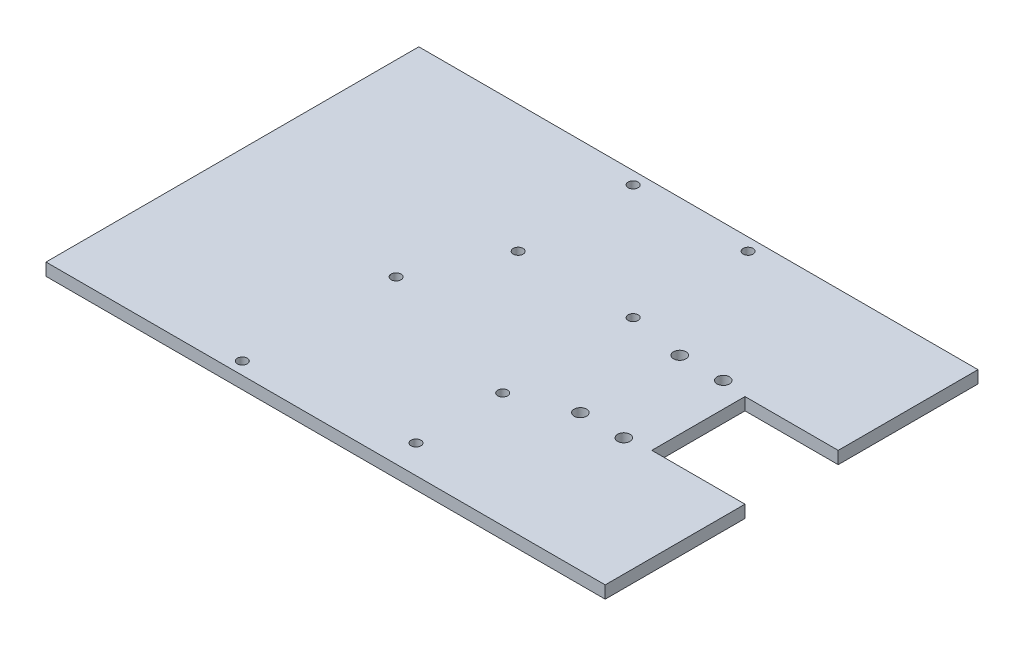
ISO-10303-21;
HEADER;
FILE_DESCRIPTION(('STEP AP214'),'2;1');
FILE_NAME('part.step','',(''),(''),'','','');
FILE_SCHEMA(('AUTOMOTIVE_DESIGN { 1 0 10303 214 1 1 1 1 }'));
ENDSEC;
DATA;
#1=APPLICATION_CONTEXT('core data for automotive mechanical design processes');
#2=APPLICATION_PROTOCOL_DEFINITION('international standard','automotive_design',2000,#1);
#3=PRODUCT_CONTEXT('',#1,'mechanical');
#4=PRODUCT('Part','Part','',(#3));
#5=PRODUCT_RELATED_PRODUCT_CATEGORY('part','',(#4));
#6=PRODUCT_DEFINITION_FORMATION('','',#4);
#7=PRODUCT_DEFINITION_CONTEXT('part definition',#1,'design');
#8=PRODUCT_DEFINITION('design','',#6,#7);
#9=PRODUCT_DEFINITION_SHAPE('','',#8);
#10=(LENGTH_UNIT() NAMED_UNIT(*) SI_UNIT(.MILLI.,.METRE.));
#11=(NAMED_UNIT(*) PLANE_ANGLE_UNIT() SI_UNIT($,.RADIAN.));
#12=(NAMED_UNIT(*) SI_UNIT($,.STERADIAN.) SOLID_ANGLE_UNIT());
#13=UNCERTAINTY_MEASURE_WITH_UNIT(LENGTH_MEASURE(1.E-05),#10,'distance_accuracy_value','');
#14=(GEOMETRIC_REPRESENTATION_CONTEXT(3) GLOBAL_UNCERTAINTY_ASSIGNED_CONTEXT((#13)) GLOBAL_UNIT_ASSIGNED_CONTEXT((#10,
#11,#12)) REPRESENTATION_CONTEXT('',''));
#15=CARTESIAN_POINT('',(0.,0.,0.));
#16=DIRECTION('',(0.,0.,1.));
#17=DIRECTION('',(1.,0.,0.));
#18=AXIS2_PLACEMENT_3D('',#15,#16,#17);
#19=CARTESIAN_POINT('',(90.,4.,60.));
#20=DIRECTION('',(-1.,0.,0.));
#21=DIRECTION('',(0.,0.,1.));
#22=AXIS2_PLACEMENT_3D('',#19,#20,#21);
#23=PLANE('',#22);
#24=DIRECTION('',(0.,0.,-1.));
#25=VECTOR('',#24,1.);
#26=CARTESIAN_POINT('',(90.,0.,60.));
#27=LINE('',#26,#25);
#28=CARTESIAN_POINT('',(90.,0.,60.));
#29=VERTEX_POINT('',#28);
#30=CARTESIAN_POINT('',(90.,0.,15.));
#31=VERTEX_POINT('',#30);
#32=EDGE_CURVE('E154',#29,#31,#27,.T.);
#33=ORIENTED_EDGE('',*,*,#32,.T.);
#34=DIRECTION('',(0.,1.,0.));
#35=VECTOR('',#34,1.);
#36=CARTESIAN_POINT('',(90.,4.,15.));
#37=LINE('',#36,#35);
#38=CARTESIAN_POINT('',(90.,4.,15.));
#39=VERTEX_POINT('',#38);
#40=EDGE_CURVE('E122',#31,#39,#37,.T.);
#41=ORIENTED_EDGE('',*,*,#40,.T.);
#42=DIRECTION('',(0.,0.,-1.));
#43=VECTOR('',#42,1.);
#44=CARTESIAN_POINT('',(90.,4.,60.));
#45=LINE('',#44,#43);
#46=CARTESIAN_POINT('',(90.,4.,60.));
#47=VERTEX_POINT('',#46);
#48=EDGE_CURVE('E146',#47,#39,#45,.T.);
#49=ORIENTED_EDGE('',*,*,#48,.F.);
#50=DIRECTION('',(0.,-1.,0.));
#51=VECTOR('',#50,1.);
#52=CARTESIAN_POINT('',(90.,4.,60.));
#53=LINE('',#52,#51);
#54=EDGE_CURVE('E153',#47,#29,#53,.T.);
#55=ORIENTED_EDGE('',*,*,#54,.T.);
#56=EDGE_LOOP('',(#33,#41,#49,#55));
#57=FACE_BOUND('',#56,.T.);
#58=ADVANCED_FACE('F35',(#57),#23,.F.);
#59=CARTESIAN_POINT('',(90.,4.,-15.));
#60=VERTEX_POINT('',#59);
#61=CARTESIAN_POINT('',(90.,4.,-60.));
#62=VERTEX_POINT('',#61);
#63=EDGE_CURVE('E87',#60,#62,#45,.T.);
#64=ORIENTED_EDGE('',*,*,#63,.F.);
#65=DIRECTION('',(0.,-1.,0.));
#66=VECTOR('',#65,1.);
#67=CARTESIAN_POINT('',(90.,4.,-15.));
#68=LINE('',#67,#66);
#69=CARTESIAN_POINT('',(90.,0.,-15.));
#70=VERTEX_POINT('',#69);
#71=EDGE_CURVE('E115',#60,#70,#68,.T.);
#72=ORIENTED_EDGE('',*,*,#71,.T.);
#73=CARTESIAN_POINT('',(90.,0.,-60.));
#74=VERTEX_POINT('',#73);
#75=EDGE_CURVE('E145',#70,#74,#27,.T.);
#76=ORIENTED_EDGE('',*,*,#75,.T.);
#77=DIRECTION('',(0.,-1.,0.));
#78=VECTOR('',#77,1.);
#79=CARTESIAN_POINT('',(90.,4.,-60.));
#80=LINE('',#79,#78);
#81=EDGE_CURVE('E43',#62,#74,#80,.T.);
#82=ORIENTED_EDGE('',*,*,#81,.F.);
#83=EDGE_LOOP('',(#64,#72,#76,#82));
#84=FACE_BOUND('',#83,.T.);
#85=ADVANCED_FACE('F37',(#84),#23,.F.);
#86=CARTESIAN_POINT('',(-90.,4.,-60.));
#87=DIRECTION('',(0.,0.,1.));
#88=DIRECTION('',(1.,0.,0.));
#89=AXIS2_PLACEMENT_3D('',#86,#87,#88);
#90=PLANE('',#89);
#91=DIRECTION('',(-1.,0.,0.));
#92=VECTOR('',#91,1.);
#93=CARTESIAN_POINT('',(-90.,0.,-60.));
#94=LINE('',#93,#92);
#95=CARTESIAN_POINT('',(-90.,0.,-60.));
#96=VERTEX_POINT('',#95);
#97=EDGE_CURVE('E156',#74,#96,#94,.T.);
#98=ORIENTED_EDGE('',*,*,#97,.T.);
#99=DIRECTION('',(0.,-1.,0.));
#100=VECTOR('',#99,1.);
#101=CARTESIAN_POINT('',(-90.,4.,-60.));
#102=LINE('',#101,#100);
#103=CARTESIAN_POINT('',(-90.,4.,-60.));
#104=VERTEX_POINT('',#103);
#105=EDGE_CURVE('E164',#104,#96,#102,.T.);
#106=ORIENTED_EDGE('',*,*,#105,.F.);
#107=DIRECTION('',(-1.,0.,0.));
#108=VECTOR('',#107,1.);
#109=CARTESIAN_POINT('',(-90.,4.,-60.));
#110=LINE('',#109,#108);
#111=EDGE_CURVE('E148',#62,#104,#110,.T.);
#112=ORIENTED_EDGE('',*,*,#111,.F.);
#113=ORIENTED_EDGE('',*,*,#81,.T.);
#114=EDGE_LOOP('',(#98,#106,#112,#113));
#115=FACE_BOUND('',#114,.T.);
#116=ADVANCED_FACE('F169',(#115),#90,.F.);
#117=CARTESIAN_POINT('',(-90.,4.,60.));
#118=DIRECTION('',(1.,0.,0.));
#119=DIRECTION('',(0.,0.,-1.));
#120=AXIS2_PLACEMENT_3D('',#117,#118,#119);
#121=PLANE('',#120);
#122=DIRECTION('',(0.,0.,1.));
#123=VECTOR('',#122,1.);
#124=CARTESIAN_POINT('',(-90.,0.,60.));
#125=LINE('',#124,#123);
#126=CARTESIAN_POINT('',(-90.,0.,60.));
#127=VERTEX_POINT('',#126);
#128=EDGE_CURVE('E158',#96,#127,#125,.T.);
#129=ORIENTED_EDGE('',*,*,#128,.T.);
#130=DIRECTION('',(0.,-1.,0.));
#131=VECTOR('',#130,1.);
#132=CARTESIAN_POINT('',(-90.,4.,60.));
#133=LINE('',#132,#131);
#134=CARTESIAN_POINT('',(-90.,4.,60.));
#135=VERTEX_POINT('',#134);
#136=EDGE_CURVE('E162',#135,#127,#133,.T.);
#137=ORIENTED_EDGE('',*,*,#136,.F.);
#138=DIRECTION('',(0.,0.,1.));
#139=VECTOR('',#138,1.);
#140=CARTESIAN_POINT('',(-90.,4.,60.));
#141=LINE('',#140,#139);
#142=EDGE_CURVE('E150',#104,#135,#141,.T.);
#143=ORIENTED_EDGE('',*,*,#142,.F.);
#144=ORIENTED_EDGE('',*,*,#105,.T.);
#145=EDGE_LOOP('',(#129,#137,#143,#144));
#146=FACE_BOUND('',#145,.T.);
#147=ADVANCED_FACE('F176',(#146),#121,.F.);
#148=CARTESIAN_POINT('',(-90.,4.,60.));
#149=DIRECTION('',(0.,0.,-1.));
#150=DIRECTION('',(-1.,0.,0.));
#151=AXIS2_PLACEMENT_3D('',#148,#149,#150);
#152=PLANE('',#151);
#153=DIRECTION('',(1.,0.,0.));
#154=VECTOR('',#153,1.);
#155=CARTESIAN_POINT('',(-90.,0.,60.));
#156=LINE('',#155,#154);
#157=EDGE_CURVE('E80',#127,#29,#156,.T.);
#158=ORIENTED_EDGE('',*,*,#157,.T.);
#159=ORIENTED_EDGE('',*,*,#54,.F.);
#160=DIRECTION('',(1.,0.,0.));
#161=VECTOR('',#160,1.);
#162=CARTESIAN_POINT('',(-90.,4.,60.));
#163=LINE('',#162,#161);
#164=EDGE_CURVE('E59',#135,#47,#163,.T.);
#165=ORIENTED_EDGE('',*,*,#164,.F.);
#166=ORIENTED_EDGE('',*,*,#136,.T.);
#167=EDGE_LOOP('',(#158,#159,#165,#166));
#168=FACE_BOUND('',#167,.T.);
#169=ADVANCED_FACE('F178',(#168),#152,.F.);
#170=CARTESIAN_POINT('',(0.,4.,0.));
#171=DIRECTION('',(0.,-1.,0.));
#172=DIRECTION('',(0.,0.,-1.));
#173=AXIS2_PLACEMENT_3D('',#170,#171,#172);
#174=PLANE('',#173);
#175=CARTESIAN_POINT('',(38.,4.,16.));
#176=DIRECTION('',(0.,-1.,0.));
#177=DIRECTION('',(0.,0.,-1.));
#178=AXIS2_PLACEMENT_3D('',#175,#176,#177);
#179=CIRCLE('',#178,2.);
#180=CARTESIAN_POINT('',(38.,4.,14.));
#181=VERTEX_POINT('',#180);
#182=EDGE_CURVE('E217',#181,#181,#179,.T.);
#183=ORIENTED_EDGE('',*,*,#182,.T.);
#184=EDGE_LOOP('',(#183));
#185=FACE_BOUND('',#184,.T.);
#186=CARTESIAN_POINT('',(52.,4.,-16.));
#187=DIRECTION('',(0.,-1.,0.));
#188=DIRECTION('',(0.,0.,-1.));
#189=AXIS2_PLACEMENT_3D('',#186,#187,#188);
#190=CIRCLE('',#189,2.);
#191=CARTESIAN_POINT('',(52.,4.,-18.));
#192=VERTEX_POINT('',#191);
#193=EDGE_CURVE('E221',#192,#192,#190,.T.);
#194=ORIENTED_EDGE('',*,*,#193,.T.);
#195=EDGE_LOOP('',(#194));
#196=FACE_BOUND('',#195,.T.);
#197=CARTESIAN_POINT('',(38.,4.,-16.));
#198=DIRECTION('',(0.,-1.,0.));
#199=DIRECTION('',(0.,0.,-1.));
#200=AXIS2_PLACEMENT_3D('',#197,#198,#199);
#201=CIRCLE('',#200,2.);
#202=CARTESIAN_POINT('',(38.,4.,-18.));
#203=VERTEX_POINT('',#202);
#204=EDGE_CURVE('E225',#203,#203,#201,.T.);
#205=ORIENTED_EDGE('',*,*,#204,.T.);
#206=EDGE_LOOP('',(#205));
#207=FACE_BOUND('',#206,.T.);
#208=CARTESIAN_POINT('',(52.,4.,16.));
#209=DIRECTION('',(0.,-1.,0.));
#210=DIRECTION('',(0.,0.,-1.));
#211=AXIS2_PLACEMENT_3D('',#208,#209,#210);
#212=CIRCLE('',#211,2.);
#213=CARTESIAN_POINT('',(52.,4.,14.));
#214=VERTEX_POINT('',#213);
#215=EDGE_CURVE('E229',#214,#214,#212,.T.);
#216=ORIENTED_EDGE('',*,*,#215,.T.);
#217=EDGE_LOOP('',(#216));
#218=FACE_BOUND('',#217,.T.);
#219=CARTESIAN_POINT('',(-29.5,4.,7.80000000000001));
#220=DIRECTION('',(0.,1.,0.));
#221=DIRECTION('',(0.,0.,1.));
#222=AXIS2_PLACEMENT_3D('',#219,#220,#221);
#223=CIRCLE('',#222,1.60000000000001);
#224=CARTESIAN_POINT('',(-29.5,4.,9.40000000000001));
#225=VERTEX_POINT('',#224);
#226=EDGE_CURVE('E233',#225,#225,#223,.T.);
#227=ORIENTED_EDGE('',*,*,#226,.F.);
#228=EDGE_LOOP('',(#227));
#229=FACE_BOUND('',#228,.T.);
#230=CARTESIAN_POINT('',(20.,4.,23.));
#231=DIRECTION('',(0.,1.,0.));
#232=DIRECTION('',(0.,0.,1.));
#233=AXIS2_PLACEMENT_3D('',#230,#231,#232);
#234=CIRCLE('',#233,1.6);
#235=CARTESIAN_POINT('',(20.,4.,24.6));
#236=VERTEX_POINT('',#235);
#237=EDGE_CURVE('E237',#236,#236,#234,.T.);
#238=ORIENTED_EDGE('',*,*,#237,.F.);
#239=EDGE_LOOP('',(#238));
#240=FACE_BOUND('',#239,.T.);
#241=CARTESIAN_POINT('',(20.,4.,50.9));
#242=DIRECTION('',(0.,1.,0.));
#243=DIRECTION('',(0.,0.,1.));
#244=AXIS2_PLACEMENT_3D('',#241,#242,#243);
#245=CIRCLE('',#244,1.60000000000001);
#246=CARTESIAN_POINT('',(20.,4.,52.5));
#247=VERTEX_POINT('',#246);
#248=EDGE_CURVE('E241',#247,#247,#245,.T.);
#249=ORIENTED_EDGE('',*,*,#248,.F.);
#250=EDGE_LOOP('',(#249));
#251=FACE_BOUND('',#250,.T.);
#252=CARTESIAN_POINT('',(-30.8,4.,56.));
#253=DIRECTION('',(0.,1.,0.));
#254=DIRECTION('',(0.,0.,1.));
#255=AXIS2_PLACEMENT_3D('',#252,#253,#254);
#256=CIRCLE('',#255,1.60000000000001);
#257=CARTESIAN_POINT('',(-30.8,4.,57.6));
#258=VERTEX_POINT('',#257);
#259=EDGE_CURVE('E245',#258,#258,#256,.T.);
#260=ORIENTED_EDGE('',*,*,#259,.F.);
#261=EDGE_LOOP('',(#260));
#262=FACE_BOUND('',#261,.T.);
#263=CARTESIAN_POINT('',(20.,4.,-19.));
#264=DIRECTION('',(0.,1.,0.));
#265=DIRECTION('',(0.,0.,1.));
#266=AXIS2_PLACEMENT_3D('',#263,#264,#265);
#267=CIRCLE('',#266,1.6);
#268=CARTESIAN_POINT('',(20.,4.,-17.4));
#269=VERTEX_POINT('',#268);
#270=EDGE_CURVE('E249',#269,#269,#267,.T.);
#271=ORIENTED_EDGE('',*,*,#270,.F.);
#272=EDGE_LOOP('',(#271));
#273=FACE_BOUND('',#272,.T.);
#274=CARTESIAN_POINT('',(-17.,4.,-56.));
#275=DIRECTION('',(0.,1.,0.));
#276=DIRECTION('',(0.,0.,1.));
#277=AXIS2_PLACEMENT_3D('',#274,#275,#276);
#278=CIRCLE('',#277,1.60000000000001);
#279=CARTESIAN_POINT('',(-17.,4.,-54.4));
#280=VERTEX_POINT('',#279);
#281=EDGE_CURVE('E253',#280,#280,#278,.T.);
#282=ORIENTED_EDGE('',*,*,#281,.F.);
#283=EDGE_LOOP('',(#282));
#284=FACE_BOUND('',#283,.T.);
#285=CARTESIAN_POINT('',(-17.,4.,-19.));
#286=DIRECTION('',(0.,1.,0.));
#287=DIRECTION('',(0.,0.,1.));
#288=AXIS2_PLACEMENT_3D('',#285,#286,#287);
#289=CIRCLE('',#288,1.6);
#290=CARTESIAN_POINT('',(-17.,4.,-17.4));
#291=VERTEX_POINT('',#290);
#292=EDGE_CURVE('E257',#291,#291,#289,.T.);
#293=ORIENTED_EDGE('',*,*,#292,.F.);
#294=EDGE_LOOP('',(#293));
#295=FACE_BOUND('',#294,.T.);
#296=CARTESIAN_POINT('',(20.,4.,-56.));
#297=DIRECTION('',(0.,1.,0.));
#298=DIRECTION('',(0.,0.,1.));
#299=AXIS2_PLACEMENT_3D('',#296,#297,#298);
#300=CIRCLE('',#299,1.6);
#301=CARTESIAN_POINT('',(20.,4.,-54.4));
#302=VERTEX_POINT('',#301);
#303=EDGE_CURVE('E134',#302,#302,#300,.T.);
#304=ORIENTED_EDGE('',*,*,#303,.F.);
#305=EDGE_LOOP('',(#304));
#306=FACE_BOUND('',#305,.T.);
#307=ORIENTED_EDGE('',*,*,#48,.T.);
#308=DIRECTION('',(1.,0.,0.));
#309=VECTOR('',#308,1.);
#310=CARTESIAN_POINT('',(60.,4.,15.));
#311=LINE('',#310,#309);
#312=CARTESIAN_POINT('',(60.,4.,15.));
#313=VERTEX_POINT('',#312);
#314=EDGE_CURVE('E130',#313,#39,#311,.T.);
#315=ORIENTED_EDGE('',*,*,#314,.F.);
#316=DIRECTION('',(0.,0.,1.));
#317=VECTOR('',#316,1.);
#318=CARTESIAN_POINT('',(60.,4.,15.));
#319=LINE('',#318,#317);
#320=CARTESIAN_POINT('',(60.,4.,-15.));
#321=VERTEX_POINT('',#320);
#322=EDGE_CURVE('E112',#321,#313,#319,.T.);
#323=ORIENTED_EDGE('',*,*,#322,.F.);
#324=DIRECTION('',(-1.,0.,0.));
#325=VECTOR('',#324,1.);
#326=CARTESIAN_POINT('',(60.,4.,-15.));
#327=LINE('',#326,#325);
#328=EDGE_CURVE('E137',#60,#321,#327,.T.);
#329=ORIENTED_EDGE('',*,*,#328,.F.);
#330=ORIENTED_EDGE('',*,*,#63,.T.);
#331=ORIENTED_EDGE('',*,*,#111,.T.);
#332=ORIENTED_EDGE('',*,*,#142,.T.);
#333=ORIENTED_EDGE('',*,*,#164,.T.);
#334=EDGE_LOOP('',(#307,#315,#323,#329,#330,#331,#332,#333));
#335=FACE_BOUND('',#334,.T.);
#336=ADVANCED_FACE('F181',(#185,#196,#207,#218,#229,#240,#251,#262,#273,#284,#295,#306,#335),
#174,.F.);
#337=CARTESIAN_POINT('',(0.,0.,0.));
#338=DIRECTION('',(0.,-1.,0.));
#339=DIRECTION('',(0.,0.,-1.));
#340=AXIS2_PLACEMENT_3D('',#337,#338,#339);
#341=PLANE('',#340);
#342=CARTESIAN_POINT('',(38.,0.,16.));
#343=DIRECTION('',(0.,-1.,0.));
#344=DIRECTION('',(0.,0.,-1.));
#345=AXIS2_PLACEMENT_3D('',#342,#343,#344);
#346=CIRCLE('',#345,2.);
#347=CARTESIAN_POINT('',(38.,0.,14.));
#348=VERTEX_POINT('',#347);
#349=EDGE_CURVE('E303',#348,#348,#346,.T.);
#350=ORIENTED_EDGE('',*,*,#349,.F.);
#351=EDGE_LOOP('',(#350));
#352=FACE_BOUND('',#351,.T.);
#353=CARTESIAN_POINT('',(52.,0.,-16.));
#354=DIRECTION('',(0.,-1.,0.));
#355=DIRECTION('',(0.,0.,1.));
#356=AXIS2_PLACEMENT_3D('',#353,#354,#355);
#357=CIRCLE('',#356,2.);
#358=CARTESIAN_POINT('',(52.,0.,-14.));
#359=VERTEX_POINT('',#358);
#360=EDGE_CURVE('E304',#359,#359,#357,.T.);
#361=ORIENTED_EDGE('',*,*,#360,.F.);
#362=EDGE_LOOP('',(#361));
#363=FACE_BOUND('',#362,.T.);
#364=CARTESIAN_POINT('',(38.,0.,-16.));
#365=DIRECTION('',(0.,-1.,0.));
#366=DIRECTION('',(0.,0.,1.));
#367=AXIS2_PLACEMENT_3D('',#364,#365,#366);
#368=CIRCLE('',#367,2.);
#369=CARTESIAN_POINT('',(38.,0.,-14.));
#370=VERTEX_POINT('',#369);
#371=EDGE_CURVE('E307',#370,#370,#368,.T.);
#372=ORIENTED_EDGE('',*,*,#371,.F.);
#373=EDGE_LOOP('',(#372));
#374=FACE_BOUND('',#373,.T.);
#375=CARTESIAN_POINT('',(52.,0.,16.));
#376=DIRECTION('',(0.,-1.,0.));
#377=DIRECTION('',(0.,0.,-1.));
#378=AXIS2_PLACEMENT_3D('',#375,#376,#377);
#379=CIRCLE('',#378,2.);
#380=CARTESIAN_POINT('',(52.,0.,14.));
#381=VERTEX_POINT('',#380);
#382=EDGE_CURVE('E300',#381,#381,#379,.T.);
#383=ORIENTED_EDGE('',*,*,#382,.F.);
#384=EDGE_LOOP('',(#383));
#385=FACE_BOUND('',#384,.T.);
#386=CARTESIAN_POINT('',(-29.5,0.,7.80000000000001));
#387=DIRECTION('',(0.,1.,0.));
#388=DIRECTION('',(0.,0.,1.));
#389=AXIS2_PLACEMENT_3D('',#386,#387,#388);
#390=CIRCLE('',#389,1.60000000000001);
#391=CARTESIAN_POINT('',(-29.5,0.,9.40000000000001));
#392=VERTEX_POINT('',#391);
#393=EDGE_CURVE('E279',#392,#392,#390,.T.);
#394=ORIENTED_EDGE('',*,*,#393,.T.);
#395=EDGE_LOOP('',(#394));
#396=FACE_BOUND('',#395,.T.);
#397=CARTESIAN_POINT('',(20.,0.,23.));
#398=DIRECTION('',(0.,1.,0.));
#399=DIRECTION('',(0.,0.,1.));
#400=AXIS2_PLACEMENT_3D('',#397,#398,#399);
#401=CIRCLE('',#400,1.6);
#402=CARTESIAN_POINT('',(20.,0.,24.6));
#403=VERTEX_POINT('',#402);
#404=EDGE_CURVE('E290',#403,#403,#401,.T.);
#405=ORIENTED_EDGE('',*,*,#404,.T.);
#406=EDGE_LOOP('',(#405));
#407=FACE_BOUND('',#406,.T.);
#408=CARTESIAN_POINT('',(20.,0.,50.9));
#409=DIRECTION('',(0.,1.,0.));
#410=DIRECTION('',(0.,0.,1.));
#411=AXIS2_PLACEMENT_3D('',#408,#409,#410);
#412=CIRCLE('',#411,1.60000000000001);
#413=CARTESIAN_POINT('',(20.,0.,52.5));
#414=VERTEX_POINT('',#413);
#415=EDGE_CURVE('E286',#414,#414,#412,.T.);
#416=ORIENTED_EDGE('',*,*,#415,.T.);
#417=EDGE_LOOP('',(#416));
#418=FACE_BOUND('',#417,.T.);
#419=CARTESIAN_POINT('',(-30.8,0.,56.));
#420=DIRECTION('',(0.,1.,0.));
#421=DIRECTION('',(0.,0.,1.));
#422=AXIS2_PLACEMENT_3D('',#419,#420,#421);
#423=CIRCLE('',#422,1.60000000000001);
#424=CARTESIAN_POINT('',(-30.8,0.,57.6));
#425=VERTEX_POINT('',#424);
#426=EDGE_CURVE('E282',#425,#425,#423,.T.);
#427=ORIENTED_EDGE('',*,*,#426,.T.);
#428=EDGE_LOOP('',(#427));
#429=FACE_BOUND('',#428,.T.);
#430=CARTESIAN_POINT('',(20.,0.,-19.));
#431=DIRECTION('',(0.,1.,0.));
#432=DIRECTION('',(0.,0.,1.));
#433=AXIS2_PLACEMENT_3D('',#430,#431,#432);
#434=CIRCLE('',#433,1.6);
#435=CARTESIAN_POINT('',(20.,0.,-17.4));
#436=VERTEX_POINT('',#435);
#437=EDGE_CURVE('E261',#436,#436,#434,.T.);
#438=ORIENTED_EDGE('',*,*,#437,.T.);
#439=EDGE_LOOP('',(#438));
#440=FACE_BOUND('',#439,.T.);
#441=CARTESIAN_POINT('',(-17.,0.,-56.));
#442=DIRECTION('',(0.,1.,0.));
#443=DIRECTION('',(0.,0.,1.));
#444=AXIS2_PLACEMENT_3D('',#441,#442,#443);
#445=CIRCLE('',#444,1.60000000000001);
#446=CARTESIAN_POINT('',(-17.,0.,-54.4));
#447=VERTEX_POINT('',#446);
#448=EDGE_CURVE('E267',#447,#447,#445,.T.);
#449=ORIENTED_EDGE('',*,*,#448,.T.);
#450=EDGE_LOOP('',(#449));
#451=FACE_BOUND('',#450,.T.);
#452=CARTESIAN_POINT('',(-17.,0.,-19.));
#453=DIRECTION('',(0.,1.,0.));
#454=DIRECTION('',(0.,0.,1.));
#455=AXIS2_PLACEMENT_3D('',#452,#453,#454);
#456=CIRCLE('',#455,1.6);
#457=CARTESIAN_POINT('',(-17.,0.,-17.4));
#458=VERTEX_POINT('',#457);
#459=EDGE_CURVE('E274',#458,#458,#456,.T.);
#460=ORIENTED_EDGE('',*,*,#459,.T.);
#461=EDGE_LOOP('',(#460));
#462=FACE_BOUND('',#461,.T.);
#463=CARTESIAN_POINT('',(20.,0.,-56.));
#464=DIRECTION('',(0.,1.,0.));
#465=DIRECTION('',(0.,0.,1.));
#466=AXIS2_PLACEMENT_3D('',#463,#464,#465);
#467=CIRCLE('',#466,1.6);
#468=CARTESIAN_POINT('',(20.,0.,-54.4));
#469=VERTEX_POINT('',#468);
#470=EDGE_CURVE('E139',#469,#469,#467,.T.);
#471=ORIENTED_EDGE('',*,*,#470,.T.);
#472=EDGE_LOOP('',(#471));
#473=FACE_BOUND('',#472,.T.);
#474=DIRECTION('',(1.,0.,0.));
#475=VECTOR('',#474,1.);
#476=CARTESIAN_POINT('',(60.,0.,15.));
#477=LINE('',#476,#475);
#478=CARTESIAN_POINT('',(60.,0.,15.));
#479=VERTEX_POINT('',#478);
#480=EDGE_CURVE('E119',#479,#31,#477,.T.);
#481=ORIENTED_EDGE('',*,*,#480,.T.);
#482=ORIENTED_EDGE('',*,*,#32,.F.);
#483=ORIENTED_EDGE('',*,*,#157,.F.);
#484=ORIENTED_EDGE('',*,*,#128,.F.);
#485=ORIENTED_EDGE('',*,*,#97,.F.);
#486=ORIENTED_EDGE('',*,*,#75,.F.);
#487=DIRECTION('',(1.,0.,0.));
#488=VECTOR('',#487,1.);
#489=CARTESIAN_POINT('',(0.,0.,-15.));
#490=LINE('',#489,#488);
#491=CARTESIAN_POINT('',(60.,0.,-15.));
#492=VERTEX_POINT('',#491);
#493=EDGE_CURVE('E11',#492,#70,#490,.T.);
#494=ORIENTED_EDGE('',*,*,#493,.F.);
#495=DIRECTION('',(0.,0.,1.));
#496=VECTOR('',#495,1.);
#497=CARTESIAN_POINT('',(60.,0.,15.));
#498=LINE('',#497,#496);
#499=EDGE_CURVE('E50',#492,#479,#498,.T.);
#500=ORIENTED_EDGE('',*,*,#499,.T.);
#501=EDGE_LOOP('',(#481,#482,#483,#484,#485,#486,#494,#500));
#502=FACE_BOUND('',#501,.T.);
#503=ADVANCED_FACE('F128',(#352,#363,#374,#385,#396,#407,#418,#429,#440,#451,#462,#473,#502),
#341,.T.);
#504=CARTESIAN_POINT('',(60.,0.,15.));
#505=DIRECTION('',(0.,0.,1.));
#506=DIRECTION('',(1.,0.,0.));
#507=AXIS2_PLACEMENT_3D('',#504,#505,#506);
#508=PLANE('',#507);
#509=ORIENTED_EDGE('',*,*,#480,.F.);
#510=DIRECTION('',(0.,1.,0.));
#511=VECTOR('',#510,1.);
#512=CARTESIAN_POINT('',(60.,0.,15.));
#513=LINE('',#512,#511);
#514=EDGE_CURVE('E108',#479,#313,#513,.T.);
#515=ORIENTED_EDGE('',*,*,#514,.T.);
#516=ORIENTED_EDGE('',*,*,#314,.T.);
#517=ORIENTED_EDGE('',*,*,#40,.F.);
#518=EDGE_LOOP('',(#509,#515,#516,#517));
#519=FACE_BOUND('',#518,.T.);
#520=ADVANCED_FACE('F120',(#519),#508,.F.);
#521=CARTESIAN_POINT('',(60.,0.,-15.));
#522=DIRECTION('',(0.,0.,-1.));
#523=DIRECTION('',(-1.,0.,0.));
#524=AXIS2_PLACEMENT_3D('',#521,#522,#523);
#525=PLANE('',#524);
#526=ORIENTED_EDGE('',*,*,#328,.T.);
#527=DIRECTION('',(0.,1.,0.));
#528=VECTOR('',#527,1.);
#529=CARTESIAN_POINT('',(60.,0.,-15.));
#530=LINE('',#529,#528);
#531=EDGE_CURVE('E116',#492,#321,#530,.T.);
#532=ORIENTED_EDGE('',*,*,#531,.F.);
#533=ORIENTED_EDGE('',*,*,#493,.T.);
#534=ORIENTED_EDGE('',*,*,#71,.F.);
#535=EDGE_LOOP('',(#526,#532,#533,#534));
#536=FACE_BOUND('',#535,.T.);
#537=ADVANCED_FACE('F183',(#536),#525,.F.);
#538=CARTESIAN_POINT('',(60.,0.,15.));
#539=DIRECTION('',(-1.,0.,0.));
#540=DIRECTION('',(0.,0.,1.));
#541=AXIS2_PLACEMENT_3D('',#538,#539,#540);
#542=PLANE('',#541);
#543=ORIENTED_EDGE('',*,*,#322,.T.);
#544=ORIENTED_EDGE('',*,*,#514,.F.);
#545=ORIENTED_EDGE('',*,*,#499,.F.);
#546=ORIENTED_EDGE('',*,*,#531,.T.);
#547=EDGE_LOOP('',(#543,#544,#545,#546));
#548=FACE_BOUND('',#547,.T.);
#549=ADVANCED_FACE('F110',(#548),#542,.F.);
#550=CARTESIAN_POINT('',(20.,0.,-56.));
#551=DIRECTION('',(0.,1.,0.));
#552=DIRECTION('',(0.,0.,1.));
#553=AXIS2_PLACEMENT_3D('',#550,#551,#552);
#554=CYLINDRICAL_SURFACE('',#553,1.6);
#555=ORIENTED_EDGE('',*,*,#470,.F.);
#556=EDGE_LOOP('',(#555));
#557=FACE_BOUND('',#556,.T.);
#558=ORIENTED_EDGE('',*,*,#303,.T.);
#559=EDGE_LOOP('',(#558));
#560=FACE_BOUND('',#559,.T.);
#561=ADVANCED_FACE('F190',(#557,#560),#554,.F.);
#562=CARTESIAN_POINT('',(-17.,0.,-19.));
#563=DIRECTION('',(0.,1.,0.));
#564=DIRECTION('',(0.,0.,1.));
#565=AXIS2_PLACEMENT_3D('',#562,#563,#564);
#566=CYLINDRICAL_SURFACE('',#565,1.6);
#567=ORIENTED_EDGE('',*,*,#459,.F.);
#568=EDGE_LOOP('',(#567));
#569=FACE_BOUND('',#568,.T.);
#570=ORIENTED_EDGE('',*,*,#292,.T.);
#571=EDGE_LOOP('',(#570));
#572=FACE_BOUND('',#571,.T.);
#573=ADVANCED_FACE('F332',(#569,#572),#566,.F.);
#574=CARTESIAN_POINT('',(-17.,0.,-56.));
#575=DIRECTION('',(0.,1.,0.));
#576=DIRECTION('',(0.,0.,1.));
#577=AXIS2_PLACEMENT_3D('',#574,#575,#576);
#578=CYLINDRICAL_SURFACE('',#577,1.60000000000001);
#579=ORIENTED_EDGE('',*,*,#448,.F.);
#580=EDGE_LOOP('',(#579));
#581=FACE_BOUND('',#580,.T.);
#582=ORIENTED_EDGE('',*,*,#281,.T.);
#583=EDGE_LOOP('',(#582));
#584=FACE_BOUND('',#583,.T.);
#585=ADVANCED_FACE('F337',(#581,#584),#578,.F.);
#586=CARTESIAN_POINT('',(20.,0.,-19.));
#587=DIRECTION('',(0.,1.,0.));
#588=DIRECTION('',(0.,0.,1.));
#589=AXIS2_PLACEMENT_3D('',#586,#587,#588);
#590=CYLINDRICAL_SURFACE('',#589,1.6);
#591=ORIENTED_EDGE('',*,*,#437,.F.);
#592=EDGE_LOOP('',(#591));
#593=FACE_BOUND('',#592,.T.);
#594=ORIENTED_EDGE('',*,*,#270,.T.);
#595=EDGE_LOOP('',(#594));
#596=FACE_BOUND('',#595,.T.);
#597=ADVANCED_FACE('F343',(#593,#596),#590,.F.);
#598=CARTESIAN_POINT('',(-30.8,0.,56.));
#599=DIRECTION('',(0.,1.,0.));
#600=DIRECTION('',(0.,0.,1.));
#601=AXIS2_PLACEMENT_3D('',#598,#599,#600);
#602=CYLINDRICAL_SURFACE('',#601,1.60000000000001);
#603=ORIENTED_EDGE('',*,*,#426,.F.);
#604=EDGE_LOOP('',(#603));
#605=FACE_BOUND('',#604,.T.);
#606=ORIENTED_EDGE('',*,*,#259,.T.);
#607=EDGE_LOOP('',(#606));
#608=FACE_BOUND('',#607,.T.);
#609=ADVANCED_FACE('F346',(#605,#608),#602,.F.);
#610=CARTESIAN_POINT('',(20.,0.,50.9));
#611=DIRECTION('',(0.,1.,0.));
#612=DIRECTION('',(0.,0.,1.));
#613=AXIS2_PLACEMENT_3D('',#610,#611,#612);
#614=CYLINDRICAL_SURFACE('',#613,1.60000000000001);
#615=ORIENTED_EDGE('',*,*,#415,.F.);
#616=EDGE_LOOP('',(#615));
#617=FACE_BOUND('',#616,.T.);
#618=ORIENTED_EDGE('',*,*,#248,.T.);
#619=EDGE_LOOP('',(#618));
#620=FACE_BOUND('',#619,.T.);
#621=ADVANCED_FACE('F351',(#617,#620),#614,.F.);
#622=CARTESIAN_POINT('',(20.,0.,23.));
#623=DIRECTION('',(0.,1.,0.));
#624=DIRECTION('',(0.,0.,1.));
#625=AXIS2_PLACEMENT_3D('',#622,#623,#624);
#626=CYLINDRICAL_SURFACE('',#625,1.6);
#627=ORIENTED_EDGE('',*,*,#404,.F.);
#628=EDGE_LOOP('',(#627));
#629=FACE_BOUND('',#628,.T.);
#630=ORIENTED_EDGE('',*,*,#237,.T.);
#631=EDGE_LOOP('',(#630));
#632=FACE_BOUND('',#631,.T.);
#633=ADVANCED_FACE('F355',(#629,#632),#626,.F.);
#634=CARTESIAN_POINT('',(-29.5,0.,7.80000000000001));
#635=DIRECTION('',(0.,1.,0.));
#636=DIRECTION('',(0.,0.,1.));
#637=AXIS2_PLACEMENT_3D('',#634,#635,#636);
#638=CYLINDRICAL_SURFACE('',#637,1.60000000000001);
#639=ORIENTED_EDGE('',*,*,#393,.F.);
#640=EDGE_LOOP('',(#639));
#641=FACE_BOUND('',#640,.T.);
#642=ORIENTED_EDGE('',*,*,#226,.T.);
#643=EDGE_LOOP('',(#642));
#644=FACE_BOUND('',#643,.T.);
#645=ADVANCED_FACE('F359',(#641,#644),#638,.F.);
#646=CARTESIAN_POINT('',(52.,10.,16.));
#647=DIRECTION('',(0.,-1.,0.));
#648=DIRECTION('',(0.,0.,-1.));
#649=AXIS2_PLACEMENT_3D('',#646,#647,#648);
#650=CYLINDRICAL_SURFACE('',#649,2.);
#651=ORIENTED_EDGE('',*,*,#382,.T.);
#652=EDGE_LOOP('',(#651));
#653=FACE_BOUND('',#652,.T.);
#654=ORIENTED_EDGE('',*,*,#215,.F.);
#655=EDGE_LOOP('',(#654));
#656=FACE_BOUND('',#655,.T.);
#657=ADVANCED_FACE('F363',(#653,#656),#650,.F.);
#658=CARTESIAN_POINT('',(38.,10.,-16.));
#659=DIRECTION('',(0.,-1.,0.));
#660=DIRECTION('',(0.,0.,-1.));
#661=AXIS2_PLACEMENT_3D('',#658,#659,#660);
#662=CYLINDRICAL_SURFACE('',#661,2.);
#663=ORIENTED_EDGE('',*,*,#371,.T.);
#664=EDGE_LOOP('',(#663));
#665=FACE_BOUND('',#664,.T.);
#666=ORIENTED_EDGE('',*,*,#204,.F.);
#667=EDGE_LOOP('',(#666));
#668=FACE_BOUND('',#667,.T.);
#669=ADVANCED_FACE('F313',(#665,#668),#662,.F.);
#670=CARTESIAN_POINT('',(52.,10.,-16.));
#671=DIRECTION('',(0.,-1.,0.));
#672=DIRECTION('',(0.,0.,-1.));
#673=AXIS2_PLACEMENT_3D('',#670,#671,#672);
#674=CYLINDRICAL_SURFACE('',#673,2.);
#675=ORIENTED_EDGE('',*,*,#360,.T.);
#676=EDGE_LOOP('',(#675));
#677=FACE_BOUND('',#676,.T.);
#678=ORIENTED_EDGE('',*,*,#193,.F.);
#679=EDGE_LOOP('',(#678));
#680=FACE_BOUND('',#679,.T.);
#681=ADVANCED_FACE('F368',(#677,#680),#674,.F.);
#682=CARTESIAN_POINT('',(38.,10.,16.));
#683=DIRECTION('',(0.,-1.,0.));
#684=DIRECTION('',(0.,0.,-1.));
#685=AXIS2_PLACEMENT_3D('',#682,#683,#684);
#686=CYLINDRICAL_SURFACE('',#685,2.);
#687=ORIENTED_EDGE('',*,*,#349,.T.);
#688=EDGE_LOOP('',(#687));
#689=FACE_BOUND('',#688,.T.);
#690=ORIENTED_EDGE('',*,*,#182,.F.);
#691=EDGE_LOOP('',(#690));
#692=FACE_BOUND('',#691,.T.);
#693=ADVANCED_FACE('F371',(#689,#692),#686,.F.);
#694=CLOSED_SHELL('',(#58,#85,#116,#147,#169,#336,#503,#520,#537,#549,#561,#573,#585,#597,#609,
#621,#633,#645,#657,#669,#681,#693));
#695=MANIFOLD_SOLID_BREP('B2',#694);
#696=ADVANCED_BREP_SHAPE_REPRESENTATION('',(#18,#695),#14);
#697=SHAPE_DEFINITION_REPRESENTATION(#9,#696);
ENDSEC;
END-ISO-10303-21;
